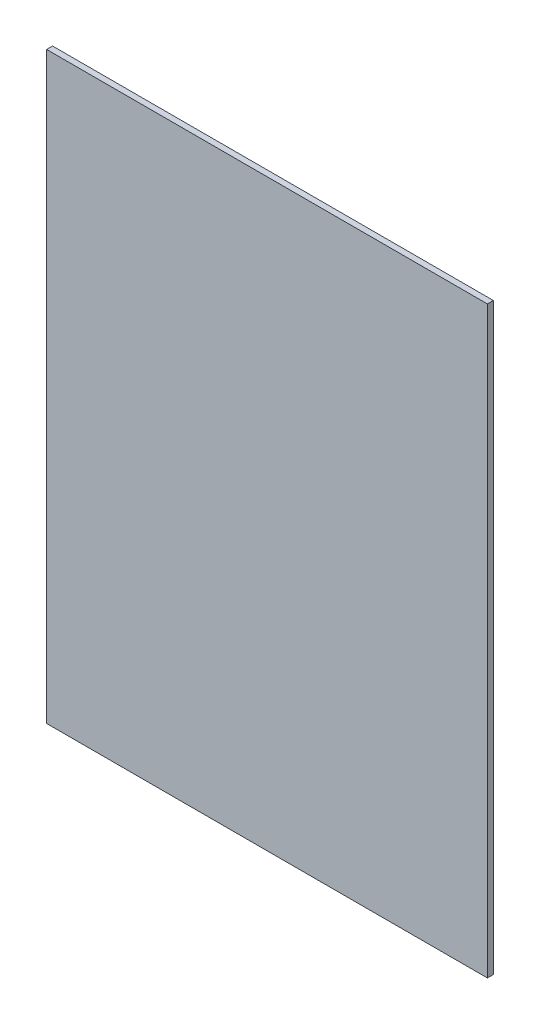
ISO-10303-21;
HEADER;
FILE_DESCRIPTION(('STEP AP214'),'2;1');
FILE_NAME('part.step','',(''),(''),'','','');
FILE_SCHEMA(('AUTOMOTIVE_DESIGN { 1 0 10303 214 1 1 1 1 }'));
ENDSEC;
DATA;
#1=APPLICATION_CONTEXT('core data for automotive mechanical design processes');
#2=APPLICATION_PROTOCOL_DEFINITION('international standard','automotive_design',2000,#1);
#3=PRODUCT_CONTEXT('',#1,'mechanical');
#4=PRODUCT('Part','Part','',(#3));
#5=PRODUCT_RELATED_PRODUCT_CATEGORY('part','',(#4));
#6=PRODUCT_DEFINITION_FORMATION('','',#4);
#7=PRODUCT_DEFINITION_CONTEXT('part definition',#1,'design');
#8=PRODUCT_DEFINITION('design','',#6,#7);
#9=PRODUCT_DEFINITION_SHAPE('','',#8);
#10=(LENGTH_UNIT() NAMED_UNIT(*) SI_UNIT(.MILLI.,.METRE.));
#11=(NAMED_UNIT(*) PLANE_ANGLE_UNIT() SI_UNIT($,.RADIAN.));
#12=(NAMED_UNIT(*) SI_UNIT($,.STERADIAN.) SOLID_ANGLE_UNIT());
#13=UNCERTAINTY_MEASURE_WITH_UNIT(LENGTH_MEASURE(1.E-05),#10,'distance_accuracy_value','');
#14=(GEOMETRIC_REPRESENTATION_CONTEXT(3) GLOBAL_UNCERTAINTY_ASSIGNED_CONTEXT((#13)) GLOBAL_UNIT_ASSIGNED_CONTEXT((#10,
#11,#12)) REPRESENTATION_CONTEXT('',''));
#15=CARTESIAN_POINT('',(0.,0.,0.));
#16=DIRECTION('',(0.,0.,1.));
#17=DIRECTION('',(1.,0.,0.));
#18=AXIS2_PLACEMENT_3D('',#15,#16,#17);
#19=CARTESIAN_POINT('',(117.475,-155.575,3.175));
#20=DIRECTION('',(-1.,0.,0.));
#21=DIRECTION('',(0.,0.,1.));
#22=AXIS2_PLACEMENT_3D('',#19,#20,#21);
#23=PLANE('',#22);
#24=DIRECTION('',(0.,1.,0.));
#25=VECTOR('',#24,1.);
#26=CARTESIAN_POINT('',(117.475,-155.575,0.));
#27=LINE('',#26,#25);
#28=CARTESIAN_POINT('',(117.475,-155.575,0.));
#29=VERTEX_POINT('',#28);
#30=CARTESIAN_POINT('',(117.475,155.575,0.));
#31=VERTEX_POINT('',#30);
#32=EDGE_CURVE('E95',#29,#31,#27,.T.);
#33=ORIENTED_EDGE('',*,*,#32,.T.);
#34=DIRECTION('',(0.,0.,-1.));
#35=VECTOR('',#34,1.);
#36=CARTESIAN_POINT('',(117.475,155.575,3.175));
#37=LINE('',#36,#35);
#38=CARTESIAN_POINT('',(117.475,155.575,3.175));
#39=VERTEX_POINT('',#38);
#40=EDGE_CURVE('E11',#39,#31,#37,.T.);
#41=ORIENTED_EDGE('',*,*,#40,.F.);
#42=DIRECTION('',(0.,1.,0.));
#43=VECTOR('',#42,1.);
#44=CARTESIAN_POINT('',(117.475,-155.575,3.175));
#45=LINE('',#44,#43);
#46=CARTESIAN_POINT('',(117.475,-155.575,3.175));
#47=VERTEX_POINT('',#46);
#48=EDGE_CURVE('E83',#47,#39,#45,.T.);
#49=ORIENTED_EDGE('',*,*,#48,.F.);
#50=DIRECTION('',(0.,0.,-1.));
#51=VECTOR('',#50,1.);
#52=CARTESIAN_POINT('',(117.475,-155.575,3.175));
#53=LINE('',#52,#51);
#54=EDGE_CURVE('E91',#47,#29,#53,.T.);
#55=ORIENTED_EDGE('',*,*,#54,.T.);
#56=EDGE_LOOP('',(#33,#41,#49,#55));
#57=FACE_BOUND('',#56,.T.);
#58=ADVANCED_FACE('F32',(#57),#23,.F.);
#59=CARTESIAN_POINT('',(-117.475,155.575,3.175));
#60=DIRECTION('',(0.,-1.,0.));
#61=DIRECTION('',(0.,0.,-1.));
#62=AXIS2_PLACEMENT_3D('',#59,#60,#61);
#63=PLANE('',#62);
#64=DIRECTION('',(-1.,0.,0.));
#65=VECTOR('',#64,1.);
#66=CARTESIAN_POINT('',(-117.475,155.575,0.));
#67=LINE('',#66,#65);
#68=CARTESIAN_POINT('',(-117.475,155.575,0.));
#69=VERTEX_POINT('',#68);
#70=EDGE_CURVE('E87',#31,#69,#67,.T.);
#71=ORIENTED_EDGE('',*,*,#70,.T.);
#72=DIRECTION('',(0.,0.,-1.));
#73=VECTOR('',#72,1.);
#74=CARTESIAN_POINT('',(-117.475,155.575,3.175));
#75=LINE('',#74,#73);
#76=CARTESIAN_POINT('',(-117.475,155.575,3.175));
#77=VERTEX_POINT('',#76);
#78=EDGE_CURVE('E40',#77,#69,#75,.T.);
#79=ORIENTED_EDGE('',*,*,#78,.F.);
#80=DIRECTION('',(-1.,0.,0.));
#81=VECTOR('',#80,1.);
#82=CARTESIAN_POINT('',(-117.475,155.575,3.175));
#83=LINE('',#82,#81);
#84=EDGE_CURVE('E78',#39,#77,#83,.T.);
#85=ORIENTED_EDGE('',*,*,#84,.F.);
#86=ORIENTED_EDGE('',*,*,#40,.T.);
#87=EDGE_LOOP('',(#71,#79,#85,#86));
#88=FACE_BOUND('',#87,.T.);
#89=ADVANCED_FACE('F86',(#88),#63,.F.);
#90=CARTESIAN_POINT('',(-117.475,-155.575,3.175));
#91=DIRECTION('',(1.,0.,0.));
#92=DIRECTION('',(0.,0.,-1.));
#93=AXIS2_PLACEMENT_3D('',#90,#91,#92);
#94=PLANE('',#93);
#95=DIRECTION('',(0.,-1.,0.));
#96=VECTOR('',#95,1.);
#97=CARTESIAN_POINT('',(-117.475,-155.575,0.));
#98=LINE('',#97,#96);
#99=CARTESIAN_POINT('',(-117.475,-155.575,0.));
#100=VERTEX_POINT('',#99);
#101=EDGE_CURVE('E65',#69,#100,#98,.T.);
#102=ORIENTED_EDGE('',*,*,#101,.T.);
#103=DIRECTION('',(0.,0.,-1.));
#104=VECTOR('',#103,1.);
#105=CARTESIAN_POINT('',(-117.475,-155.575,3.175));
#106=LINE('',#105,#104);
#107=CARTESIAN_POINT('',(-117.475,-155.575,3.175));
#108=VERTEX_POINT('',#107);
#109=EDGE_CURVE('E88',#108,#100,#106,.T.);
#110=ORIENTED_EDGE('',*,*,#109,.F.);
#111=DIRECTION('',(0.,-1.,0.));
#112=VECTOR('',#111,1.);
#113=CARTESIAN_POINT('',(-117.475,-155.575,3.175));
#114=LINE('',#113,#112);
#115=EDGE_CURVE('E81',#77,#108,#114,.T.);
#116=ORIENTED_EDGE('',*,*,#115,.F.);
#117=ORIENTED_EDGE('',*,*,#78,.T.);
#118=EDGE_LOOP('',(#102,#110,#116,#117));
#119=FACE_BOUND('',#118,.T.);
#120=ADVANCED_FACE('F89',(#119),#94,.F.);
#121=CARTESIAN_POINT('',(-117.475,-155.575,3.175));
#122=DIRECTION('',(0.,1.,0.));
#123=DIRECTION('',(0.,0.,1.));
#124=AXIS2_PLACEMENT_3D('',#121,#122,#123);
#125=PLANE('',#124);
#126=DIRECTION('',(1.,0.,0.));
#127=VECTOR('',#126,1.);
#128=CARTESIAN_POINT('',(-117.475,-155.575,0.));
#129=LINE('',#128,#127);
#130=EDGE_CURVE('E71',#100,#29,#129,.T.);
#131=ORIENTED_EDGE('',*,*,#130,.T.);
#132=ORIENTED_EDGE('',*,*,#54,.F.);
#133=DIRECTION('',(1.,0.,0.));
#134=VECTOR('',#133,1.);
#135=CARTESIAN_POINT('',(-117.475,-155.575,3.175));
#136=LINE('',#135,#134);
#137=EDGE_CURVE('E48',#108,#47,#136,.T.);
#138=ORIENTED_EDGE('',*,*,#137,.F.);
#139=ORIENTED_EDGE('',*,*,#109,.T.);
#140=EDGE_LOOP('',(#131,#132,#138,#139));
#141=FACE_BOUND('',#140,.T.);
#142=ADVANCED_FACE('F102',(#141),#125,.F.);
#143=CARTESIAN_POINT('',(117.475,155.575,3.175));
#144=DIRECTION('',(0.,0.,-1.));
#145=DIRECTION('',(-1.,0.,0.));
#146=AXIS2_PLACEMENT_3D('',#143,#144,#145);
#147=PLANE('',#146);
#148=ORIENTED_EDGE('',*,*,#48,.T.);
#149=ORIENTED_EDGE('',*,*,#84,.T.);
#150=ORIENTED_EDGE('',*,*,#115,.T.);
#151=ORIENTED_EDGE('',*,*,#137,.T.);
#152=EDGE_LOOP('',(#148,#149,#150,#151));
#153=FACE_BOUND('',#152,.T.);
#154=ADVANCED_FACE('F79',(#153),#147,.F.);
#155=CARTESIAN_POINT('',(117.475,155.575,0.));
#156=DIRECTION('',(0.,0.,-1.));
#157=DIRECTION('',(-1.,0.,0.));
#158=AXIS2_PLACEMENT_3D('',#155,#156,#157);
#159=PLANE('',#158);
#160=ORIENTED_EDGE('',*,*,#32,.F.);
#161=ORIENTED_EDGE('',*,*,#130,.F.);
#162=ORIENTED_EDGE('',*,*,#101,.F.);
#163=ORIENTED_EDGE('',*,*,#70,.F.);
#164=EDGE_LOOP('',(#160,#161,#162,#163));
#165=FACE_BOUND('',#164,.T.);
#166=ADVANCED_FACE('F105',(#165),#159,.T.);
#167=CLOSED_SHELL('',(#58,#89,#120,#142,#154,#166));
#168=MANIFOLD_SOLID_BREP('B2',#167);
#169=ADVANCED_BREP_SHAPE_REPRESENTATION('',(#18,#168),#14);
#170=SHAPE_DEFINITION_REPRESENTATION(#9,#169);
ENDSEC;
END-ISO-10303-21;
